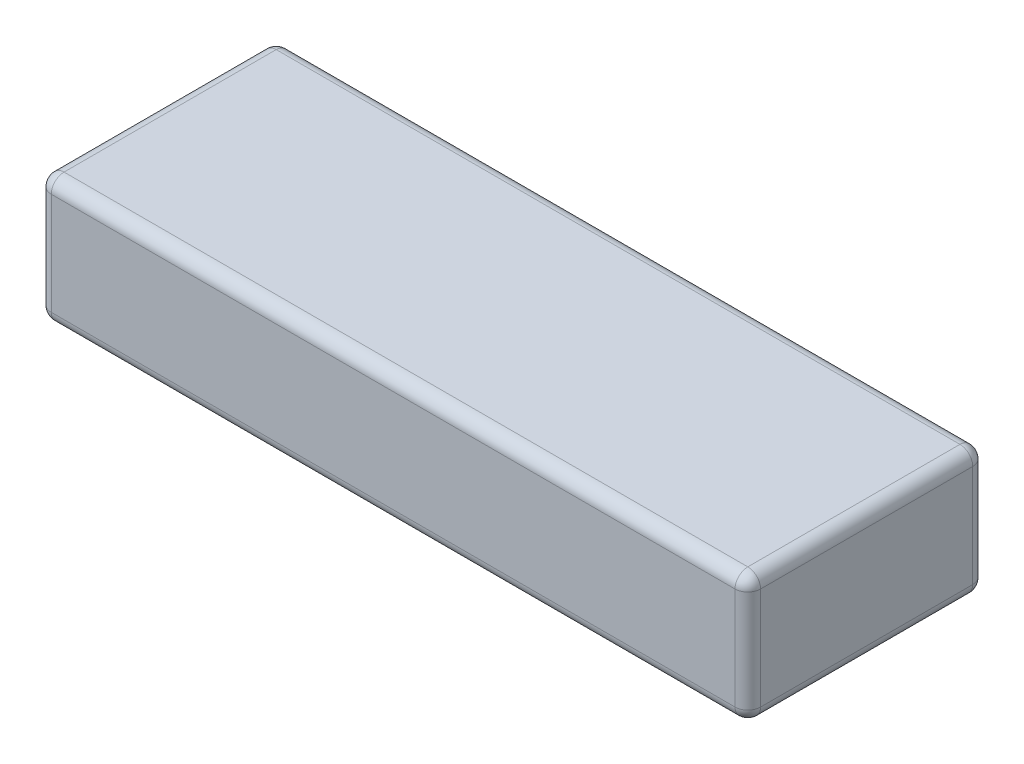
ISO-10303-21;
HEADER;
FILE_DESCRIPTION(('STEP AP214'),'2;1');
FILE_NAME('part.step','',(''),(''),'','','');
FILE_SCHEMA(('AUTOMOTIVE_DESIGN { 1 0 10303 214 1 1 1 1 }'));
ENDSEC;
DATA;
#1=APPLICATION_CONTEXT('core data for automotive mechanical design processes');
#2=APPLICATION_PROTOCOL_DEFINITION('international standard','automotive_design',2000,#1);
#3=PRODUCT_CONTEXT('',#1,'mechanical');
#4=PRODUCT('Part','Part','',(#3));
#5=PRODUCT_RELATED_PRODUCT_CATEGORY('part','',(#4));
#6=PRODUCT_DEFINITION_FORMATION('','',#4);
#7=PRODUCT_DEFINITION_CONTEXT('part definition',#1,'design');
#8=PRODUCT_DEFINITION('design','',#6,#7);
#9=PRODUCT_DEFINITION_SHAPE('','',#8);
#10=(LENGTH_UNIT() NAMED_UNIT(*) SI_UNIT(.MILLI.,.METRE.));
#11=(NAMED_UNIT(*) PLANE_ANGLE_UNIT() SI_UNIT($,.RADIAN.));
#12=(NAMED_UNIT(*) SI_UNIT($,.STERADIAN.) SOLID_ANGLE_UNIT());
#13=UNCERTAINTY_MEASURE_WITH_UNIT(LENGTH_MEASURE(1.E-05),#10,'distance_accuracy_value','');
#14=(GEOMETRIC_REPRESENTATION_CONTEXT(3) GLOBAL_UNCERTAINTY_ASSIGNED_CONTEXT((#13)) GLOBAL_UNIT_ASSIGNED_CONTEXT((#10,
#11,#12)) REPRESENTATION_CONTEXT('',''));
#15=CARTESIAN_POINT('',(0.,0.,0.));
#16=DIRECTION('',(0.,0.,1.));
#17=DIRECTION('',(1.,0.,0.));
#18=AXIS2_PLACEMENT_3D('',#15,#16,#17);
#19=CARTESIAN_POINT('',(-55.5,5.,-9.30000000000001));
#20=DIRECTION('',(0.,0.,-1.));
#21=DIRECTION('',(0.,1.,0.));
#22=AXIS2_PLACEMENT_3D('',#19,#20,#21);
#23=PLANE('',#22);
#24=DIRECTION('',(1.,0.,0.));
#25=VECTOR('',#24,1.);
#26=CARTESIAN_POINT('',(-55.5,-4.,-9.3));
#27=LINE('',#26,#25);
#28=CARTESIAN_POINT('',(-1.,-4.,-9.3));
#29=VERTEX_POINT('',#28);
#30=CARTESIAN_POINT('',(-54.5,-4.,-9.3));
#31=VERTEX_POINT('',#30);
#32=EDGE_CURVE('E210',#29,#31,#27,.F.);
#33=ORIENTED_EDGE('',*,*,#32,.T.);
#34=DIRECTION('',(0.,1.,0.));
#35=VECTOR('',#34,1.);
#36=CARTESIAN_POINT('',(-54.5,4.,-9.30000000000001));
#37=LINE('',#36,#35);
#38=CARTESIAN_POINT('',(-54.5,4.,-9.30000000000001));
#39=VERTEX_POINT('',#38);
#40=EDGE_CURVE('E236',#31,#39,#37,.T.);
#41=ORIENTED_EDGE('',*,*,#40,.T.);
#42=DIRECTION('',(1.,0.,0.));
#43=VECTOR('',#42,1.);
#44=CARTESIAN_POINT('',(-55.5,4.,-9.30000000000001));
#45=LINE('',#44,#43);
#46=CARTESIAN_POINT('',(-1.,4.,-9.30000000000001));
#47=VERTEX_POINT('',#46);
#48=EDGE_CURVE('E215',#39,#47,#45,.T.);
#49=ORIENTED_EDGE('',*,*,#48,.T.);
#50=DIRECTION('',(0.,1.,0.));
#51=VECTOR('',#50,1.);
#52=CARTESIAN_POINT('',(-1.,5.,-9.30000000000001));
#53=LINE('',#52,#51);
#54=EDGE_CURVE('E234',#47,#29,#53,.F.);
#55=ORIENTED_EDGE('',*,*,#54,.T.);
#56=EDGE_LOOP('',(#33,#41,#49,#55));
#57=FACE_BOUND('',#56,.T.);
#58=ADVANCED_FACE('F35',(#57),#23,.T.);
#59=CARTESIAN_POINT('',(-55.5,-5.,9.3));
#60=DIRECTION('',(0.,-1.,0.));
#61=DIRECTION('',(0.,0.,-1.));
#62=AXIS2_PLACEMENT_3D('',#59,#60,#61);
#63=PLANE('',#62);
#64=DIRECTION('',(1.,0.,0.));
#65=VECTOR('',#64,1.);
#66=CARTESIAN_POINT('',(-55.5,-5.,8.3));
#67=LINE('',#66,#65);
#68=CARTESIAN_POINT('',(-1.,-5.,8.3));
#69=VERTEX_POINT('',#68);
#70=CARTESIAN_POINT('',(-54.5,-5.,8.3));
#71=VERTEX_POINT('',#70);
#72=EDGE_CURVE('E147',#69,#71,#67,.F.);
#73=ORIENTED_EDGE('',*,*,#72,.T.);
#74=DIRECTION('',(0.,0.,-1.));
#75=VECTOR('',#74,1.);
#76=CARTESIAN_POINT('',(-54.5,-5.,-8.30000000000001));
#77=LINE('',#76,#75);
#78=CARTESIAN_POINT('',(-54.5,-5.,-8.30000000000001));
#79=VERTEX_POINT('',#78);
#80=EDGE_CURVE('E253',#71,#79,#77,.T.);
#81=ORIENTED_EDGE('',*,*,#80,.T.);
#82=DIRECTION('',(1.,0.,0.));
#83=VECTOR('',#82,1.);
#84=CARTESIAN_POINT('',(-55.5,-5.,-8.30000000000001));
#85=LINE('',#84,#83);
#86=CARTESIAN_POINT('',(-1.,-5.,-8.30000000000001));
#87=VERTEX_POINT('',#86);
#88=EDGE_CURVE('E225',#79,#87,#85,.T.);
#89=ORIENTED_EDGE('',*,*,#88,.T.);
#90=DIRECTION('',(0.,0.,-1.));
#91=VECTOR('',#90,1.);
#92=CARTESIAN_POINT('',(-1.,-5.,9.3));
#93=LINE('',#92,#91);
#94=EDGE_CURVE('E251',#87,#69,#93,.F.);
#95=ORIENTED_EDGE('',*,*,#94,.T.);
#96=EDGE_LOOP('',(#73,#81,#89,#95));
#97=FACE_BOUND('',#96,.T.);
#98=ADVANCED_FACE('F285',(#97),#63,.T.);
#99=CARTESIAN_POINT('',(-55.5,5.,9.3));
#100=DIRECTION('',(0.,0.,1.));
#101=DIRECTION('',(1.,0.,0.));
#102=AXIS2_PLACEMENT_3D('',#99,#100,#101);
#103=PLANE('',#102);
#104=DIRECTION('',(1.,0.,0.));
#105=VECTOR('',#104,1.);
#106=CARTESIAN_POINT('',(-55.5,4.,9.3));
#107=LINE('',#106,#105);
#108=CARTESIAN_POINT('',(-1.,4.,9.3));
#109=VERTEX_POINT('',#108);
#110=CARTESIAN_POINT('',(-54.5,4.,9.3));
#111=VERTEX_POINT('',#110);
#112=EDGE_CURVE('E228',#109,#111,#107,.F.);
#113=ORIENTED_EDGE('',*,*,#112,.T.);
#114=DIRECTION('',(0.,-1.,0.));
#115=VECTOR('',#114,1.);
#116=CARTESIAN_POINT('',(-54.5,-4.,9.3));
#117=LINE('',#116,#115);
#118=CARTESIAN_POINT('',(-54.5,-4.,9.3));
#119=VERTEX_POINT('',#118);
#120=EDGE_CURVE('E261',#111,#119,#117,.T.);
#121=ORIENTED_EDGE('',*,*,#120,.T.);
#122=DIRECTION('',(1.,0.,0.));
#123=VECTOR('',#122,1.);
#124=CARTESIAN_POINT('',(-55.5,-4.,9.3));
#125=LINE('',#124,#123);
#126=CARTESIAN_POINT('',(-1.,-4.,9.3));
#127=VERTEX_POINT('',#126);
#128=EDGE_CURVE('E155',#119,#127,#125,.T.);
#129=ORIENTED_EDGE('',*,*,#128,.T.);
#130=DIRECTION('',(0.,-1.,0.));
#131=VECTOR('',#130,1.);
#132=CARTESIAN_POINT('',(-1.,5.,9.3));
#133=LINE('',#132,#131);
#134=EDGE_CURVE('E259',#127,#109,#133,.F.);
#135=ORIENTED_EDGE('',*,*,#134,.T.);
#136=EDGE_LOOP('',(#113,#121,#129,#135));
#137=FACE_BOUND('',#136,.T.);
#138=ADVANCED_FACE('F297',(#137),#103,.T.);
#139=CARTESIAN_POINT('',(-55.5,5.,9.3));
#140=DIRECTION('',(0.,1.,0.));
#141=DIRECTION('',(0.,0.,1.));
#142=AXIS2_PLACEMENT_3D('',#139,#140,#141);
#143=PLANE('',#142);
#144=DIRECTION('',(1.,0.,0.));
#145=VECTOR('',#144,1.);
#146=CARTESIAN_POINT('',(-55.5,5.,-8.30000000000001));
#147=LINE('',#146,#145);
#148=CARTESIAN_POINT('',(-1.,5.,-8.30000000000001));
#149=VERTEX_POINT('',#148);
#150=CARTESIAN_POINT('',(-54.5,5.,-8.30000000000001));
#151=VERTEX_POINT('',#150);
#152=EDGE_CURVE('E128',#149,#151,#147,.F.);
#153=ORIENTED_EDGE('',*,*,#152,.T.);
#154=DIRECTION('',(0.,0.,1.));
#155=VECTOR('',#154,1.);
#156=CARTESIAN_POINT('',(-54.5,5.,8.3));
#157=LINE('',#156,#155);
#158=CARTESIAN_POINT('',(-54.5,5.,8.3));
#159=VERTEX_POINT('',#158);
#160=EDGE_CURVE('E11',#151,#159,#157,.T.);
#161=ORIENTED_EDGE('',*,*,#160,.T.);
#162=DIRECTION('',(1.,0.,0.));
#163=VECTOR('',#162,1.);
#164=CARTESIAN_POINT('',(-55.5,5.,8.3));
#165=LINE('',#164,#163);
#166=CARTESIAN_POINT('',(-1.,5.,8.3));
#167=VERTEX_POINT('',#166);
#168=EDGE_CURVE('E130',#159,#167,#165,.T.);
#169=ORIENTED_EDGE('',*,*,#168,.T.);
#170=DIRECTION('',(0.,0.,1.));
#171=VECTOR('',#170,1.);
#172=CARTESIAN_POINT('',(-1.,5.,9.3));
#173=LINE('',#172,#171);
#174=EDGE_CURVE('E44',#167,#149,#173,.F.);
#175=ORIENTED_EDGE('',*,*,#174,.T.);
#176=EDGE_LOOP('',(#153,#161,#169,#175));
#177=FACE_BOUND('',#176,.T.);
#178=ADVANCED_FACE('F127',(#177),#143,.T.);
#179=CARTESIAN_POINT('',(-55.5,0.,0.));
#180=DIRECTION('',(1.,0.,0.));
#181=DIRECTION('',(0.,0.,-1.));
#182=AXIS2_PLACEMENT_3D('',#179,#180,#181);
#183=PLANE('',#182);
#184=DIRECTION('',(0.,0.,1.));
#185=VECTOR('',#184,1.);
#186=CARTESIAN_POINT('',(-55.5,4.,-8.30000000000001));
#187=LINE('',#186,#185);
#188=CARTESIAN_POINT('',(-55.5,4.,8.3));
#189=VERTEX_POINT('',#188);
#190=CARTESIAN_POINT('',(-55.5,4.,-8.30000000000001));
#191=VERTEX_POINT('',#190);
#192=EDGE_CURVE('E238',#189,#191,#187,.F.);
#193=ORIENTED_EDGE('',*,*,#192,.T.);
#194=DIRECTION('',(0.,1.,0.));
#195=VECTOR('',#194,1.);
#196=CARTESIAN_POINT('',(-55.5,-4.,-8.3));
#197=LINE('',#196,#195);
#198=CARTESIAN_POINT('',(-55.5,-4.,-8.30000000000001));
#199=VERTEX_POINT('',#198);
#200=EDGE_CURVE('E244',#191,#199,#197,.F.);
#201=ORIENTED_EDGE('',*,*,#200,.T.);
#202=DIRECTION('',(0.,0.,-1.));
#203=VECTOR('',#202,1.);
#204=CARTESIAN_POINT('',(-55.5,-4.,8.3));
#205=LINE('',#204,#203);
#206=CARTESIAN_POINT('',(-55.5,-4.,8.3));
#207=VERTEX_POINT('',#206);
#208=EDGE_CURVE('E242',#199,#207,#205,.F.);
#209=ORIENTED_EDGE('',*,*,#208,.T.);
#210=DIRECTION('',(0.,-1.,0.));
#211=VECTOR('',#210,1.);
#212=CARTESIAN_POINT('',(-55.5,4.,8.3));
#213=LINE('',#212,#211);
#214=EDGE_CURVE('E240',#207,#189,#213,.F.);
#215=ORIENTED_EDGE('',*,*,#214,.T.);
#216=EDGE_LOOP('',(#193,#201,#209,#215));
#217=FACE_BOUND('',#216,.T.);
#218=ADVANCED_FACE('F312',(#217),#183,.F.);
#219=CARTESIAN_POINT('',(0.,0.,0.));
#220=DIRECTION('',(1.,0.,0.));
#221=DIRECTION('',(0.,0.,-1.));
#222=AXIS2_PLACEMENT_3D('',#219,#220,#221);
#223=PLANE('',#222);
#224=DIRECTION('',(0.,0.,-1.));
#225=VECTOR('',#224,1.);
#226=CARTESIAN_POINT('',(0.,-4.,0.));
#227=LINE('',#226,#225);
#228=CARTESIAN_POINT('',(0.,-4.,8.3));
#229=VERTEX_POINT('',#228);
#230=CARTESIAN_POINT('',(0.,-4.,-8.30000000000001));
#231=VERTEX_POINT('',#230);
#232=EDGE_CURVE('E52',#229,#231,#227,.T.);
#233=ORIENTED_EDGE('',*,*,#232,.T.);
#234=DIRECTION('',(0.,1.,0.));
#235=VECTOR('',#234,1.);
#236=CARTESIAN_POINT('',(0.,0.,-8.3));
#237=LINE('',#236,#235);
#238=CARTESIAN_POINT('',(0.,4.,-8.30000000000001));
#239=VERTEX_POINT('',#238);
#240=EDGE_CURVE('E135',#231,#239,#237,.T.);
#241=ORIENTED_EDGE('',*,*,#240,.T.);
#242=DIRECTION('',(0.,0.,1.));
#243=VECTOR('',#242,1.);
#244=CARTESIAN_POINT('',(0.,4.,0.));
#245=LINE('',#244,#243);
#246=CARTESIAN_POINT('',(0.,4.,8.3));
#247=VERTEX_POINT('',#246);
#248=EDGE_CURVE('E159',#239,#247,#245,.T.);
#249=ORIENTED_EDGE('',*,*,#248,.T.);
#250=DIRECTION('',(0.,-1.,0.));
#251=VECTOR('',#250,1.);
#252=CARTESIAN_POINT('',(0.,0.,8.3));
#253=LINE('',#252,#251);
#254=EDGE_CURVE('E57',#247,#229,#253,.T.);
#255=ORIENTED_EDGE('',*,*,#254,.T.);
#256=EDGE_LOOP('',(#233,#241,#249,#255));
#257=FACE_BOUND('',#256,.T.);
#258=ADVANCED_FACE('F271',(#257),#223,.T.);
#259=CARTESIAN_POINT('',(-55.5,4.,-8.30000000000001));
#260=DIRECTION('',(1.,0.,0.));
#261=DIRECTION('',(0.,0.,-1.));
#262=AXIS2_PLACEMENT_3D('',#259,#260,#261);
#263=CYLINDRICAL_SURFACE('',#262,1.);
#264=ORIENTED_EDGE('',*,*,#48,.F.);
#265=CARTESIAN_POINT('',(-54.5,4.,-8.30000000000001));
#266=DIRECTION('',(1.,0.,0.));
#267=DIRECTION('',(0.,0.,-1.));
#268=AXIS2_PLACEMENT_3D('',#265,#266,#267);
#269=CIRCLE('',#268,1.);
#270=EDGE_CURVE('E146',#39,#151,#269,.T.);
#271=ORIENTED_EDGE('',*,*,#270,.T.);
#272=ORIENTED_EDGE('',*,*,#152,.F.);
#273=CARTESIAN_POINT('',(-1.,4.,-8.30000000000001));
#274=DIRECTION('',(1.,0.,0.));
#275=DIRECTION('',(0.,0.,-1.));
#276=AXIS2_PLACEMENT_3D('',#273,#274,#275);
#277=CIRCLE('',#276,1.);
#278=EDGE_CURVE('E143',#149,#47,#277,.F.);
#279=ORIENTED_EDGE('',*,*,#278,.T.);
#280=EDGE_LOOP('',(#264,#271,#272,#279));
#281=FACE_BOUND('',#280,.T.);
#282=ADVANCED_FACE('F142',(#281),#263,.T.);
#283=CARTESIAN_POINT('',(-55.5,-4.,-8.30000000000001));
#284=DIRECTION('',(1.,0.,0.));
#285=DIRECTION('',(0.,0.,-1.));
#286=AXIS2_PLACEMENT_3D('',#283,#284,#285);
#287=CYLINDRICAL_SURFACE('',#286,1.);
#288=ORIENTED_EDGE('',*,*,#88,.F.);
#289=CARTESIAN_POINT('',(-54.5,-4.,-8.30000000000001));
#290=DIRECTION('',(1.,0.,0.));
#291=DIRECTION('',(0.,0.,-1.));
#292=AXIS2_PLACEMENT_3D('',#289,#290,#291);
#293=CIRCLE('',#292,1.);
#294=EDGE_CURVE('E249',#79,#31,#293,.T.);
#295=ORIENTED_EDGE('',*,*,#294,.T.);
#296=ORIENTED_EDGE('',*,*,#32,.F.);
#297=CARTESIAN_POINT('',(-1.,-4.,-8.30000000000001));
#298=DIRECTION('',(1.,0.,0.));
#299=DIRECTION('',(0.,0.,-1.));
#300=AXIS2_PLACEMENT_3D('',#297,#298,#299);
#301=CIRCLE('',#300,1.);
#302=EDGE_CURVE('E247',#29,#87,#301,.F.);
#303=ORIENTED_EDGE('',*,*,#302,.T.);
#304=EDGE_LOOP('',(#288,#295,#296,#303));
#305=FACE_BOUND('',#304,.T.);
#306=ADVANCED_FACE('F278',(#305),#287,.T.);
#307=CARTESIAN_POINT('',(-55.5,-4.,8.3));
#308=DIRECTION('',(1.,0.,0.));
#309=DIRECTION('',(0.,0.,-1.));
#310=AXIS2_PLACEMENT_3D('',#307,#308,#309);
#311=CYLINDRICAL_SURFACE('',#310,1.);
#312=ORIENTED_EDGE('',*,*,#128,.F.);
#313=CARTESIAN_POINT('',(-54.5,-4.,8.3));
#314=DIRECTION('',(1.,0.,0.));
#315=DIRECTION('',(0.,0.,-1.));
#316=AXIS2_PLACEMENT_3D('',#313,#314,#315);
#317=CIRCLE('',#316,1.);
#318=EDGE_CURVE('E257',#119,#71,#317,.T.);
#319=ORIENTED_EDGE('',*,*,#318,.T.);
#320=ORIENTED_EDGE('',*,*,#72,.F.);
#321=CARTESIAN_POINT('',(-1.,-4.,8.3));
#322=DIRECTION('',(1.,0.,0.));
#323=DIRECTION('',(0.,0.,-1.));
#324=AXIS2_PLACEMENT_3D('',#321,#322,#323);
#325=CIRCLE('',#324,1.);
#326=EDGE_CURVE('E255',#69,#127,#325,.F.);
#327=ORIENTED_EDGE('',*,*,#326,.T.);
#328=EDGE_LOOP('',(#312,#319,#320,#327));
#329=FACE_BOUND('',#328,.T.);
#330=ADVANCED_FACE('F289',(#329),#311,.T.);
#331=CARTESIAN_POINT('',(-55.5,4.,8.3));
#332=DIRECTION('',(1.,0.,0.));
#333=DIRECTION('',(0.,0.,-1.));
#334=AXIS2_PLACEMENT_3D('',#331,#332,#333);
#335=CYLINDRICAL_SURFACE('',#334,1.);
#336=ORIENTED_EDGE('',*,*,#168,.F.);
#337=CARTESIAN_POINT('',(-54.5,4.,8.3));
#338=DIRECTION('',(1.,0.,0.));
#339=DIRECTION('',(0.,0.,-1.));
#340=AXIS2_PLACEMENT_3D('',#337,#338,#339);
#341=CIRCLE('',#340,1.);
#342=EDGE_CURVE('E265',#159,#111,#341,.T.);
#343=ORIENTED_EDGE('',*,*,#342,.T.);
#344=ORIENTED_EDGE('',*,*,#112,.F.);
#345=CARTESIAN_POINT('',(-1.,4.,8.3));
#346=DIRECTION('',(1.,0.,0.));
#347=DIRECTION('',(0.,0.,-1.));
#348=AXIS2_PLACEMENT_3D('',#345,#346,#347);
#349=CIRCLE('',#348,1.);
#350=EDGE_CURVE('E263',#109,#167,#349,.F.);
#351=ORIENTED_EDGE('',*,*,#350,.T.);
#352=EDGE_LOOP('',(#336,#343,#344,#351));
#353=FACE_BOUND('',#352,.T.);
#354=ADVANCED_FACE('F299',(#353),#335,.T.);
#355=CARTESIAN_POINT('',(-54.5,-4.,8.3));
#356=DIRECTION('',(1.,0.,0.));
#357=DIRECTION('',(0.,0.,-1.));
#358=AXIS2_PLACEMENT_3D('',#355,#356,#357);
#359=SPHERICAL_SURFACE('',#358,1.);
#360=CARTESIAN_POINT('',(-54.5,-4.,8.3));
#361=DIRECTION('',(0.,0.,-1.));
#362=DIRECTION('',(-1.,0.,0.));
#363=AXIS2_PLACEMENT_3D('',#360,#361,#362);
#364=CIRCLE('',#363,1.);
#365=EDGE_CURVE('E202',#71,#207,#364,.T.);
#366=ORIENTED_EDGE('',*,*,#365,.F.);
#367=ORIENTED_EDGE('',*,*,#318,.F.);
#368=CARTESIAN_POINT('',(-54.5,-4.,8.3));
#369=DIRECTION('',(0.,1.,0.));
#370=DIRECTION('',(0.,0.,1.));
#371=AXIS2_PLACEMENT_3D('',#368,#369,#370);
#372=CIRCLE('',#371,1.);
#373=EDGE_CURVE('E164',#207,#119,#372,.T.);
#374=ORIENTED_EDGE('',*,*,#373,.F.);
#375=EDGE_LOOP('',(#366,#367,#374));
#376=FACE_BOUND('',#375,.T.);
#377=ADVANCED_FACE('F328',(#376),#359,.T.);
#378=CARTESIAN_POINT('',(-54.5,5.,8.3));
#379=DIRECTION('',(0.,1.,0.));
#380=DIRECTION('',(0.,0.,1.));
#381=AXIS2_PLACEMENT_3D('',#378,#379,#380);
#382=CYLINDRICAL_SURFACE('',#381,1.);
#383=ORIENTED_EDGE('',*,*,#373,.T.);
#384=ORIENTED_EDGE('',*,*,#120,.F.);
#385=CARTESIAN_POINT('',(-54.5,4.,8.3));
#386=DIRECTION('',(0.,1.,0.));
#387=DIRECTION('',(0.,0.,1.));
#388=AXIS2_PLACEMENT_3D('',#385,#386,#387);
#389=CIRCLE('',#388,1.);
#390=EDGE_CURVE('E200',#189,#111,#389,.T.);
#391=ORIENTED_EDGE('',*,*,#390,.F.);
#392=ORIENTED_EDGE('',*,*,#214,.F.);
#393=EDGE_LOOP('',(#383,#384,#391,#392));
#394=FACE_BOUND('',#393,.T.);
#395=ADVANCED_FACE('F321',(#394),#382,.T.);
#396=CARTESIAN_POINT('',(-54.5,-4.,9.3));
#397=DIRECTION('',(0.,0.,1.));
#398=DIRECTION('',(1.,0.,0.));
#399=AXIS2_PLACEMENT_3D('',#396,#397,#398);
#400=CYLINDRICAL_SURFACE('',#399,1.);
#401=ORIENTED_EDGE('',*,*,#365,.T.);
#402=ORIENTED_EDGE('',*,*,#208,.F.);
#403=CARTESIAN_POINT('',(-54.5,-4.,-8.30000000000001));
#404=DIRECTION('',(0.,0.,-1.));
#405=DIRECTION('',(-1.,0.,0.));
#406=AXIS2_PLACEMENT_3D('',#403,#404,#405);
#407=CIRCLE('',#406,1.);
#408=EDGE_CURVE('E197',#79,#199,#407,.T.);
#409=ORIENTED_EDGE('',*,*,#408,.F.);
#410=ORIENTED_EDGE('',*,*,#80,.F.);
#411=EDGE_LOOP('',(#401,#402,#409,#410));
#412=FACE_BOUND('',#411,.T.);
#413=ADVANCED_FACE('F319',(#412),#400,.T.);
#414=CARTESIAN_POINT('',(-54.5,4.,8.3));
#415=DIRECTION('',(1.,0.,0.));
#416=DIRECTION('',(0.,0.,-1.));
#417=AXIS2_PLACEMENT_3D('',#414,#415,#416);
#418=SPHERICAL_SURFACE('',#417,1.);
#419=ORIENTED_EDGE('',*,*,#390,.T.);
#420=ORIENTED_EDGE('',*,*,#342,.F.);
#421=CARTESIAN_POINT('',(-54.5,4.,8.3));
#422=DIRECTION('',(0.,0.,-1.));
#423=DIRECTION('',(-1.,0.,0.));
#424=AXIS2_PLACEMENT_3D('',#421,#422,#423);
#425=CIRCLE('',#424,1.);
#426=EDGE_CURVE('E194',#189,#159,#425,.T.);
#427=ORIENTED_EDGE('',*,*,#426,.F.);
#428=EDGE_LOOP('',(#419,#420,#427));
#429=FACE_BOUND('',#428,.T.);
#430=ADVANCED_FACE('F303',(#429),#418,.T.);
#431=CARTESIAN_POINT('',(-54.5,-4.,-8.30000000000001));
#432=DIRECTION('',(1.,0.,0.));
#433=DIRECTION('',(0.,0.,-1.));
#434=AXIS2_PLACEMENT_3D('',#431,#432,#433);
#435=SPHERICAL_SURFACE('',#434,1.);
#436=ORIENTED_EDGE('',*,*,#294,.F.);
#437=ORIENTED_EDGE('',*,*,#408,.T.);
#438=CARTESIAN_POINT('',(-54.5,-4.,-8.30000000000001));
#439=DIRECTION('',(0.,1.,0.));
#440=DIRECTION('',(0.,0.,1.));
#441=AXIS2_PLACEMENT_3D('',#438,#439,#440);
#442=CIRCLE('',#441,1.);
#443=EDGE_CURVE('E190',#31,#199,#442,.T.);
#444=ORIENTED_EDGE('',*,*,#443,.F.);
#445=EDGE_LOOP('',(#436,#437,#444));
#446=FACE_BOUND('',#445,.T.);
#447=ADVANCED_FACE('F318',(#446),#435,.T.);
#448=CARTESIAN_POINT('',(-54.5,4.,9.3));
#449=DIRECTION('',(0.,0.,-1.));
#450=DIRECTION('',(-1.,0.,0.));
#451=AXIS2_PLACEMENT_3D('',#448,#449,#450);
#452=CYLINDRICAL_SURFACE('',#451,1.);
#453=ORIENTED_EDGE('',*,*,#426,.T.);
#454=ORIENTED_EDGE('',*,*,#160,.F.);
#455=CARTESIAN_POINT('',(-54.5,4.,-8.30000000000001));
#456=DIRECTION('',(0.,0.,-1.));
#457=DIRECTION('',(-1.,0.,0.));
#458=AXIS2_PLACEMENT_3D('',#455,#456,#457);
#459=CIRCLE('',#458,1.);
#460=EDGE_CURVE('E186',#191,#151,#459,.T.);
#461=ORIENTED_EDGE('',*,*,#460,.F.);
#462=ORIENTED_EDGE('',*,*,#192,.F.);
#463=EDGE_LOOP('',(#453,#454,#461,#462));
#464=FACE_BOUND('',#463,.T.);
#465=ADVANCED_FACE('F308',(#464),#452,.T.);
#466=CARTESIAN_POINT('',(-54.5,5.,-8.30000000000001));
#467=DIRECTION('',(0.,-1.,0.));
#468=DIRECTION('',(0.,0.,-1.));
#469=AXIS2_PLACEMENT_3D('',#466,#467,#468);
#470=CYLINDRICAL_SURFACE('',#469,1.);
#471=ORIENTED_EDGE('',*,*,#443,.T.);
#472=ORIENTED_EDGE('',*,*,#200,.F.);
#473=CARTESIAN_POINT('',(-54.5,4.,-8.30000000000001));
#474=DIRECTION('',(0.,1.,0.));
#475=DIRECTION('',(0.,0.,1.));
#476=AXIS2_PLACEMENT_3D('',#473,#474,#475);
#477=CIRCLE('',#476,1.);
#478=EDGE_CURVE('E182',#39,#191,#477,.T.);
#479=ORIENTED_EDGE('',*,*,#478,.F.);
#480=ORIENTED_EDGE('',*,*,#40,.F.);
#481=EDGE_LOOP('',(#471,#472,#479,#480));
#482=FACE_BOUND('',#481,.T.);
#483=ADVANCED_FACE('F314',(#482),#470,.T.);
#484=CARTESIAN_POINT('',(-54.5,4.,-8.30000000000001));
#485=DIRECTION('',(1.,0.,0.));
#486=DIRECTION('',(0.,0.,-1.));
#487=AXIS2_PLACEMENT_3D('',#484,#485,#486);
#488=SPHERICAL_SURFACE('',#487,1.);
#489=ORIENTED_EDGE('',*,*,#460,.T.);
#490=ORIENTED_EDGE('',*,*,#270,.F.);
#491=ORIENTED_EDGE('',*,*,#478,.T.);
#492=EDGE_LOOP('',(#489,#490,#491));
#493=FACE_BOUND('',#492,.T.);
#494=ADVANCED_FACE('F347',(#493),#488,.T.);
#495=CARTESIAN_POINT('',(-1.,-4.,8.3));
#496=DIRECTION('',(1.,0.,0.));
#497=DIRECTION('',(0.,0.,-1.));
#498=AXIS2_PLACEMENT_3D('',#495,#496,#497);
#499=SPHERICAL_SURFACE('',#498,1.);
#500=CARTESIAN_POINT('',(-1.,-4.,8.3));
#501=DIRECTION('',(0.,1.,0.));
#502=DIRECTION('',(0.,0.,1.));
#503=AXIS2_PLACEMENT_3D('',#500,#501,#502);
#504=CIRCLE('',#503,1.);
#505=EDGE_CURVE('E176',#127,#229,#504,.T.);
#506=ORIENTED_EDGE('',*,*,#505,.F.);
#507=ORIENTED_EDGE('',*,*,#326,.F.);
#508=CARTESIAN_POINT('',(-1.,-4.,8.3));
#509=DIRECTION('',(0.,0.,-1.));
#510=DIRECTION('',(-1.,0.,0.));
#511=AXIS2_PLACEMENT_3D('',#508,#509,#510);
#512=CIRCLE('',#511,1.);
#513=EDGE_CURVE('E39',#229,#69,#512,.T.);
#514=ORIENTED_EDGE('',*,*,#513,.F.);
#515=EDGE_LOOP('',(#506,#507,#514));
#516=FACE_BOUND('',#515,.T.);
#517=ADVANCED_FACE('F37',(#516),#499,.T.);
#518=CARTESIAN_POINT('',(-1.,-4.,0.));
#519=DIRECTION('',(0.,0.,-1.));
#520=DIRECTION('',(-1.,0.,0.));
#521=AXIS2_PLACEMENT_3D('',#518,#519,#520);
#522=CYLINDRICAL_SURFACE('',#521,1.);
#523=ORIENTED_EDGE('',*,*,#513,.T.);
#524=ORIENTED_EDGE('',*,*,#94,.F.);
#525=CARTESIAN_POINT('',(-1.,-4.,-8.30000000000001));
#526=DIRECTION('',(0.,0.,-1.));
#527=DIRECTION('',(-1.,0.,0.));
#528=AXIS2_PLACEMENT_3D('',#525,#526,#527);
#529=CIRCLE('',#528,1.);
#530=EDGE_CURVE('E174',#231,#87,#529,.T.);
#531=ORIENTED_EDGE('',*,*,#530,.F.);
#532=ORIENTED_EDGE('',*,*,#232,.F.);
#533=EDGE_LOOP('',(#523,#524,#531,#532));
#534=FACE_BOUND('',#533,.T.);
#535=ADVANCED_FACE('F282',(#534),#522,.T.);
#536=CARTESIAN_POINT('',(-1.,0.,8.3));
#537=DIRECTION('',(0.,-1.,0.));
#538=DIRECTION('',(0.,0.,-1.));
#539=AXIS2_PLACEMENT_3D('',#536,#537,#538);
#540=CYLINDRICAL_SURFACE('',#539,1.);
#541=ORIENTED_EDGE('',*,*,#505,.T.);
#542=ORIENTED_EDGE('',*,*,#254,.F.);
#543=CARTESIAN_POINT('',(-1.,4.,8.3));
#544=DIRECTION('',(0.,1.,0.));
#545=DIRECTION('',(0.,0.,1.));
#546=AXIS2_PLACEMENT_3D('',#543,#544,#545);
#547=CIRCLE('',#546,1.);
#548=EDGE_CURVE('E171',#109,#247,#547,.T.);
#549=ORIENTED_EDGE('',*,*,#548,.F.);
#550=ORIENTED_EDGE('',*,*,#134,.F.);
#551=EDGE_LOOP('',(#541,#542,#549,#550));
#552=FACE_BOUND('',#551,.T.);
#553=ADVANCED_FACE('F293',(#552),#540,.T.);
#554=CARTESIAN_POINT('',(-1.,-4.,-8.30000000000001));
#555=DIRECTION('',(1.,0.,0.));
#556=DIRECTION('',(0.,0.,-1.));
#557=AXIS2_PLACEMENT_3D('',#554,#555,#556);
#558=SPHERICAL_SURFACE('',#557,1.);
#559=ORIENTED_EDGE('',*,*,#530,.T.);
#560=ORIENTED_EDGE('',*,*,#302,.F.);
#561=CARTESIAN_POINT('',(-1.,-4.,-8.30000000000001));
#562=DIRECTION('',(0.,1.,0.));
#563=DIRECTION('',(0.,0.,1.));
#564=AXIS2_PLACEMENT_3D('',#561,#562,#563);
#565=CIRCLE('',#564,1.);
#566=EDGE_CURVE('E168',#231,#29,#565,.T.);
#567=ORIENTED_EDGE('',*,*,#566,.F.);
#568=EDGE_LOOP('',(#559,#560,#567));
#569=FACE_BOUND('',#568,.T.);
#570=ADVANCED_FACE('F281',(#569),#558,.T.);
#571=CARTESIAN_POINT('',(-1.,4.,8.3));
#572=DIRECTION('',(1.,0.,0.));
#573=DIRECTION('',(0.,0.,-1.));
#574=AXIS2_PLACEMENT_3D('',#571,#572,#573);
#575=SPHERICAL_SURFACE('',#574,1.);
#576=ORIENTED_EDGE('',*,*,#350,.F.);
#577=ORIENTED_EDGE('',*,*,#548,.T.);
#578=CARTESIAN_POINT('',(-1.,4.,8.3));
#579=DIRECTION('',(0.,0.,-1.));
#580=DIRECTION('',(-1.,0.,0.));
#581=AXIS2_PLACEMENT_3D('',#578,#579,#580);
#582=CIRCLE('',#581,1.);
#583=EDGE_CURVE('E161',#167,#247,#582,.T.);
#584=ORIENTED_EDGE('',*,*,#583,.F.);
#585=EDGE_LOOP('',(#576,#577,#584));
#586=FACE_BOUND('',#585,.T.);
#587=ADVANCED_FACE('F393',(#586),#575,.T.);
#588=CARTESIAN_POINT('',(-1.,0.,-8.3));
#589=DIRECTION('',(0.,1.,0.));
#590=DIRECTION('',(0.,0.,1.));
#591=AXIS2_PLACEMENT_3D('',#588,#589,#590);
#592=CYLINDRICAL_SURFACE('',#591,1.);
#593=ORIENTED_EDGE('',*,*,#566,.T.);
#594=ORIENTED_EDGE('',*,*,#54,.F.);
#595=CARTESIAN_POINT('',(-1.,4.,-8.3));
#596=DIRECTION('',(0.,1.,0.));
#597=DIRECTION('',(0.,0.,1.));
#598=AXIS2_PLACEMENT_3D('',#595,#596,#597);
#599=CIRCLE('',#598,1.);
#600=EDGE_CURVE('E153',#239,#47,#599,.T.);
#601=ORIENTED_EDGE('',*,*,#600,.F.);
#602=ORIENTED_EDGE('',*,*,#240,.F.);
#603=EDGE_LOOP('',(#593,#594,#601,#602));
#604=FACE_BOUND('',#603,.T.);
#605=ADVANCED_FACE('F273',(#604),#592,.T.);
#606=CARTESIAN_POINT('',(-1.,4.,0.));
#607=DIRECTION('',(0.,0.,1.));
#608=DIRECTION('',(1.,0.,0.));
#609=AXIS2_PLACEMENT_3D('',#606,#607,#608);
#610=CYLINDRICAL_SURFACE('',#609,1.);
#611=ORIENTED_EDGE('',*,*,#583,.T.);
#612=ORIENTED_EDGE('',*,*,#248,.F.);
#613=CARTESIAN_POINT('',(-1.,4.,-8.30000000000001));
#614=DIRECTION('',(0.,0.,-1.));
#615=DIRECTION('',(-1.,0.,0.));
#616=AXIS2_PLACEMENT_3D('',#613,#614,#615);
#617=CIRCLE('',#616,1.);
#618=EDGE_CURVE('E151',#149,#239,#617,.T.);
#619=ORIENTED_EDGE('',*,*,#618,.F.);
#620=ORIENTED_EDGE('',*,*,#174,.F.);
#621=EDGE_LOOP('',(#611,#612,#619,#620));
#622=FACE_BOUND('',#621,.T.);
#623=ADVANCED_FACE('F158',(#622),#610,.T.);
#624=CARTESIAN_POINT('',(-1.,4.,-8.30000000000001));
#625=DIRECTION('',(1.,0.,0.));
#626=DIRECTION('',(0.,0.,-1.));
#627=AXIS2_PLACEMENT_3D('',#624,#625,#626);
#628=SPHERICAL_SURFACE('',#627,1.);
#629=ORIENTED_EDGE('',*,*,#600,.T.);
#630=ORIENTED_EDGE('',*,*,#278,.F.);
#631=ORIENTED_EDGE('',*,*,#618,.T.);
#632=EDGE_LOOP('',(#629,#630,#631));
#633=FACE_BOUND('',#632,.T.);
#634=ADVANCED_FACE('F150',(#633),#628,.T.);
#635=CLOSED_SHELL('',(#58,#98,#138,#178,#218,#258,#282,#306,#330,#354,#377,#395,#413,#430,#447,
#465,#483,#494,#517,#535,#553,#570,#587,#605,#623,#634));
#636=MANIFOLD_SOLID_BREP('B2',#635);
#637=ADVANCED_BREP_SHAPE_REPRESENTATION('',(#18,#636),#14);
#638=SHAPE_DEFINITION_REPRESENTATION(#9,#637);
ENDSEC;
END-ISO-10303-21;
